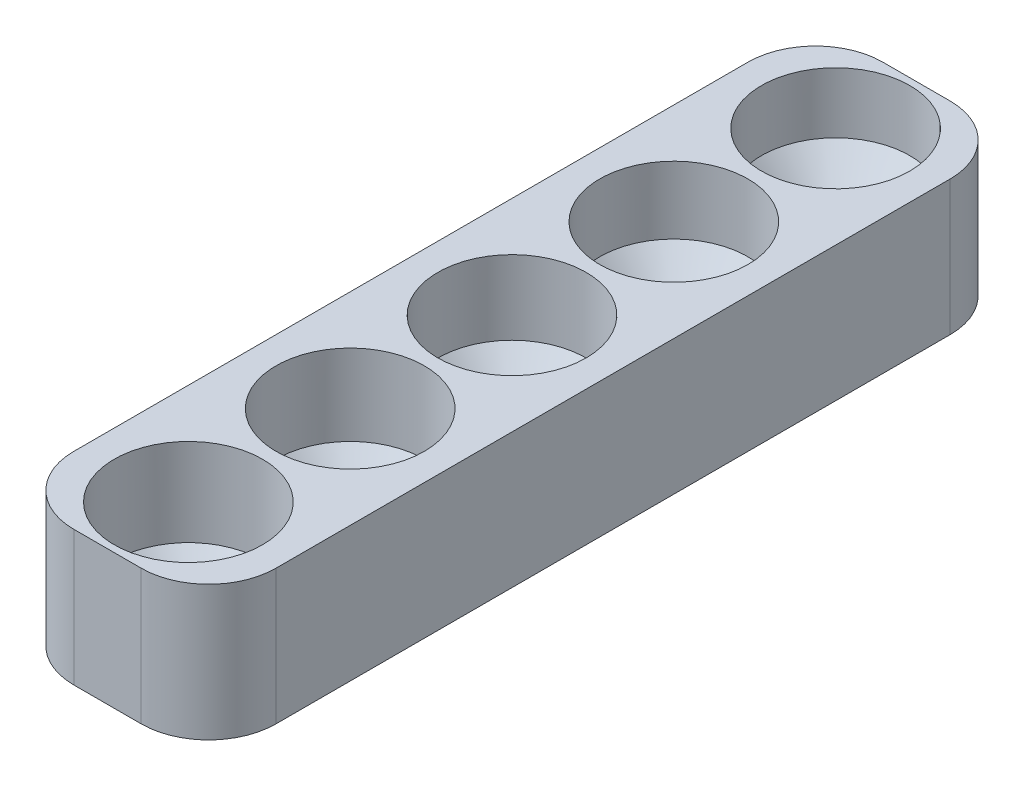
ISO-10303-21;
HEADER;
FILE_DESCRIPTION(('STEP AP214'),'2;1');
FILE_NAME('part.step','',(''),(''),'','','');
FILE_SCHEMA(('AUTOMOTIVE_DESIGN { 1 0 10303 214 1 1 1 1 }'));
ENDSEC;
DATA;
#1=APPLICATION_CONTEXT('core data for automotive mechanical design processes');
#2=APPLICATION_PROTOCOL_DEFINITION('international standard','automotive_design',2000,#1);
#3=PRODUCT_CONTEXT('',#1,'mechanical');
#4=PRODUCT('Part','Part','',(#3));
#5=PRODUCT_RELATED_PRODUCT_CATEGORY('part','',(#4));
#6=PRODUCT_DEFINITION_FORMATION('','',#4);
#7=PRODUCT_DEFINITION_CONTEXT('part definition',#1,'design');
#8=PRODUCT_DEFINITION('design','',#6,#7);
#9=PRODUCT_DEFINITION_SHAPE('','',#8);
#10=(LENGTH_UNIT() NAMED_UNIT(*) SI_UNIT(.MILLI.,.METRE.));
#11=(NAMED_UNIT(*) PLANE_ANGLE_UNIT() SI_UNIT($,.RADIAN.));
#12=(NAMED_UNIT(*) SI_UNIT($,.STERADIAN.) SOLID_ANGLE_UNIT());
#13=UNCERTAINTY_MEASURE_WITH_UNIT(LENGTH_MEASURE(1.E-05),#10,'distance_accuracy_value','');
#14=(GEOMETRIC_REPRESENTATION_CONTEXT(3) GLOBAL_UNCERTAINTY_ASSIGNED_CONTEXT((#13)) GLOBAL_UNIT_ASSIGNED_CONTEXT((#10,
#11,#12)) REPRESENTATION_CONTEXT('',''));
#15=CARTESIAN_POINT('',(0.,0.,0.));
#16=DIRECTION('',(0.,0.,1.));
#17=DIRECTION('',(1.,0.,0.));
#18=AXIS2_PLACEMENT_3D('',#15,#16,#17);
#19=CARTESIAN_POINT('',(-15.,3.,60.));
#20=DIRECTION('',(1.,0.,0.));
#21=DIRECTION('',(0.,1.,0.));
#22=AXIS2_PLACEMENT_3D('',#19,#20,#21);
#23=PLANE('',#22);
#24=DIRECTION('',(0.,0.,-1.));
#25=VECTOR('',#24,1.);
#26=CARTESIAN_POINT('',(-15.,3.,60.));
#27=LINE('',#26,#25);
#28=CARTESIAN_POINT('',(-15.,3.,50.));
#29=VERTEX_POINT('',#28);
#30=CARTESIAN_POINT('',(-15.,3.,-50.));
#31=VERTEX_POINT('',#30);
#32=EDGE_CURVE('E165',#29,#31,#27,.T.);
#33=ORIENTED_EDGE('',*,*,#32,.F.);
#34=DIRECTION('',(0.,-1.,0.));
#35=VECTOR('',#34,1.);
#36=CARTESIAN_POINT('',(-15.,3.,50.));
#37=LINE('',#36,#35);
#38=CARTESIAN_POINT('',(-15.,23.,50.));
#39=VERTEX_POINT('',#38);
#40=EDGE_CURVE('E119',#29,#39,#37,.F.);
#41=ORIENTED_EDGE('',*,*,#40,.T.);
#42=DIRECTION('',(0.,0.,-1.));
#43=VECTOR('',#42,1.);
#44=CARTESIAN_POINT('',(-15.,23.,60.));
#45=LINE('',#44,#43);
#46=CARTESIAN_POINT('',(-15.,23.,-50.));
#47=VERTEX_POINT('',#46);
#48=EDGE_CURVE('E149',#39,#47,#45,.T.);
#49=ORIENTED_EDGE('',*,*,#48,.T.);
#50=DIRECTION('',(0.,-1.,0.));
#51=VECTOR('',#50,1.);
#52=CARTESIAN_POINT('',(-15.,3.,-50.));
#53=LINE('',#52,#51);
#54=EDGE_CURVE('E125',#47,#31,#53,.T.);
#55=ORIENTED_EDGE('',*,*,#54,.T.);
#56=EDGE_LOOP('',(#33,#41,#49,#55));
#57=FACE_BOUND('',#56,.T.);
#58=ADVANCED_FACE('F47',(#57),#23,.F.);
#59=CARTESIAN_POINT('',(-15.,3.,60.));
#60=DIRECTION('',(0.,1.,0.));
#61=DIRECTION('',(-1.,0.,0.));
#62=AXIS2_PLACEMENT_3D('',#59,#60,#61);
#63=PLANE('',#62);
#64=CARTESIAN_POINT('',(0.,3.,48.));
#65=DIRECTION('',(0.,1.,0.));
#66=DIRECTION('',(-1.,0.,0.));
#67=AXIS2_PLACEMENT_3D('',#64,#65,#66);
#68=CIRCLE('',#67,4.5798188998388);
#69=CARTESIAN_POINT('',(-4.57981889983881,3.,48.));
#70=VERTEX_POINT('',#69);
#71=EDGE_CURVE('E205',#70,#70,#68,.T.);
#72=ORIENTED_EDGE('',*,*,#71,.T.);
#73=EDGE_LOOP('',(#72));
#74=FACE_BOUND('',#73,.T.);
#75=CARTESIAN_POINT('',(0.,3.,-24.));
#76=DIRECTION('',(0.,1.,0.));
#77=DIRECTION('',(-1.,0.,0.));
#78=AXIS2_PLACEMENT_3D('',#75,#76,#77);
#79=CIRCLE('',#78,1.83333333333334);
#80=CARTESIAN_POINT('',(0.,3.,-22.1666666666667));
#81=VERTEX_POINT('',#80);
#82=EDGE_CURVE('E201',#81,#81,#79,.T.);
#83=ORIENTED_EDGE('',*,*,#82,.T.);
#84=EDGE_LOOP('',(#83));
#85=FACE_BOUND('',#84,.T.);
#86=CARTESIAN_POINT('',(0.,3.,-48.));
#87=DIRECTION('',(0.,1.,0.));
#88=DIRECTION('',(-1.,0.,0.));
#89=AXIS2_PLACEMENT_3D('',#86,#87,#88);
#90=CIRCLE('',#89,0.91666666666667);
#91=CARTESIAN_POINT('',(0.,3.,-47.0833333333333));
#92=VERTEX_POINT('',#91);
#93=EDGE_CURVE('E197',#92,#92,#90,.T.);
#94=ORIENTED_EDGE('',*,*,#93,.T.);
#95=EDGE_LOOP('',(#94));
#96=FACE_BOUND('',#95,.T.);
#97=CARTESIAN_POINT('',(0.,3.,24.));
#98=DIRECTION('',(0.,1.,0.));
#99=DIRECTION('',(-1.,0.,0.));
#100=AXIS2_PLACEMENT_3D('',#97,#98,#99);
#101=CIRCLE('',#100,3.6649094499194);
#102=CARTESIAN_POINT('',(0.,3.,27.6649094499194));
#103=VERTEX_POINT('',#102);
#104=EDGE_CURVE('E193',#103,#103,#101,.T.);
#105=ORIENTED_EDGE('',*,*,#104,.T.);
#106=EDGE_LOOP('',(#105));
#107=FACE_BOUND('',#106,.T.);
#108=CARTESIAN_POINT('',(0.,3.,0.));
#109=DIRECTION('',(0.,1.,0.));
#110=DIRECTION('',(-1.,0.,0.));
#111=AXIS2_PLACEMENT_3D('',#108,#109,#110);
#112=CIRCLE('',#111,2.75);
#113=CARTESIAN_POINT('',(0.,3.,2.75));
#114=VERTEX_POINT('',#113);
#115=EDGE_CURVE('E189',#114,#114,#112,.T.);
#116=ORIENTED_EDGE('',*,*,#115,.T.);
#117=EDGE_LOOP('',(#116));
#118=FACE_BOUND('',#117,.T.);
#119=DIRECTION('',(1.,0.,0.));
#120=VECTOR('',#119,1.);
#121=CARTESIAN_POINT('',(-15.,3.,60.));
#122=LINE('',#121,#120);
#123=CARTESIAN_POINT('',(-4.99999999999999,3.,60.));
#124=VERTEX_POINT('',#123);
#125=CARTESIAN_POINT('',(5.,3.,60.));
#126=VERTEX_POINT('',#125);
#127=EDGE_CURVE('E133',#124,#126,#122,.T.);
#128=ORIENTED_EDGE('',*,*,#127,.F.);
#129=CARTESIAN_POINT('',(-4.99999999999999,3.,50.));
#130=DIRECTION('',(0.,1.,0.));
#131=DIRECTION('',(-1.,0.,0.));
#132=AXIS2_PLACEMENT_3D('',#129,#130,#131);
#133=CIRCLE('',#132,10.);
#134=EDGE_CURVE('E114',#124,#29,#133,.F.);
#135=ORIENTED_EDGE('',*,*,#134,.T.);
#136=ORIENTED_EDGE('',*,*,#32,.T.);
#137=CARTESIAN_POINT('',(-4.99999999999999,3.,-50.));
#138=DIRECTION('',(0.,1.,0.));
#139=DIRECTION('',(-1.,0.,0.));
#140=AXIS2_PLACEMENT_3D('',#137,#138,#139);
#141=CIRCLE('',#140,10.);
#142=CARTESIAN_POINT('',(-4.99999999999999,3.,-60.));
#143=VERTEX_POINT('',#142);
#144=EDGE_CURVE('E126',#31,#143,#141,.F.);
#145=ORIENTED_EDGE('',*,*,#144,.T.);
#146=DIRECTION('',(1.,0.,0.));
#147=VECTOR('',#146,1.);
#148=CARTESIAN_POINT('',(-15.,3.,-60.));
#149=LINE('',#148,#147);
#150=CARTESIAN_POINT('',(5.,3.,-60.));
#151=VERTEX_POINT('',#150);
#152=EDGE_CURVE('E151',#143,#151,#149,.T.);
#153=ORIENTED_EDGE('',*,*,#152,.T.);
#154=CARTESIAN_POINT('',(5.,3.,-50.));
#155=DIRECTION('',(0.,1.,0.));
#156=DIRECTION('',(-1.,0.,0.));
#157=AXIS2_PLACEMENT_3D('',#154,#155,#156);
#158=CIRCLE('',#157,10.);
#159=CARTESIAN_POINT('',(15.,3.,-50.));
#160=VERTEX_POINT('',#159);
#161=EDGE_CURVE('E213',#151,#160,#158,.F.);
#162=ORIENTED_EDGE('',*,*,#161,.T.);
#163=DIRECTION('',(0.,0.,-1.));
#164=VECTOR('',#163,1.);
#165=CARTESIAN_POINT('',(15.,3.,60.));
#166=LINE('',#165,#164);
#167=CARTESIAN_POINT('',(15.,3.,50.));
#168=VERTEX_POINT('',#167);
#169=EDGE_CURVE('E161',#168,#160,#166,.T.);
#170=ORIENTED_EDGE('',*,*,#169,.F.);
#171=CARTESIAN_POINT('',(5.,3.,50.));
#172=DIRECTION('',(0.,1.,0.));
#173=DIRECTION('',(-1.,0.,0.));
#174=AXIS2_PLACEMENT_3D('',#171,#172,#173);
#175=CIRCLE('',#174,10.);
#176=EDGE_CURVE('E138',#168,#126,#175,.F.);
#177=ORIENTED_EDGE('',*,*,#176,.T.);
#178=EDGE_LOOP('',(#128,#135,#136,#145,#153,#162,#170,#177));
#179=FACE_BOUND('',#178,.T.);
#180=ADVANCED_FACE('F141',(#74,#85,#96,#107,#118,#179),#63,.F.);
#181=CARTESIAN_POINT('',(15.,3.,60.));
#182=DIRECTION('',(-1.,0.,0.));
#183=DIRECTION('',(0.,0.,1.));
#184=AXIS2_PLACEMENT_3D('',#181,#182,#183);
#185=PLANE('',#184);
#186=ORIENTED_EDGE('',*,*,#169,.T.);
#187=DIRECTION('',(0.,1.,0.));
#188=VECTOR('',#187,1.);
#189=CARTESIAN_POINT('',(15.,23.,-50.));
#190=LINE('',#189,#188);
#191=CARTESIAN_POINT('',(15.,23.,-50.));
#192=VERTEX_POINT('',#191);
#193=EDGE_CURVE('E11',#160,#192,#190,.T.);
#194=ORIENTED_EDGE('',*,*,#193,.T.);
#195=DIRECTION('',(0.,0.,-1.));
#196=VECTOR('',#195,1.);
#197=CARTESIAN_POINT('',(15.,23.,60.));
#198=LINE('',#197,#196);
#199=CARTESIAN_POINT('',(15.,23.,50.));
#200=VERTEX_POINT('',#199);
#201=EDGE_CURVE('E158',#200,#192,#198,.T.);
#202=ORIENTED_EDGE('',*,*,#201,.F.);
#203=DIRECTION('',(0.,1.,0.));
#204=VECTOR('',#203,1.);
#205=CARTESIAN_POINT('',(15.,3.,50.));
#206=LINE('',#205,#204);
#207=EDGE_CURVE('E56',#200,#168,#206,.F.);
#208=ORIENTED_EDGE('',*,*,#207,.T.);
#209=EDGE_LOOP('',(#186,#194,#202,#208));
#210=FACE_BOUND('',#209,.T.);
#211=ADVANCED_FACE('F242',(#210),#185,.F.);
#212=CARTESIAN_POINT('',(-15.,23.,60.));
#213=DIRECTION('',(0.,-1.,0.));
#214=DIRECTION('',(1.,0.,0.));
#215=AXIS2_PLACEMENT_3D('',#212,#213,#214);
#216=PLANE('',#215);
#217=CARTESIAN_POINT('',(0.,23.,48.));
#218=DIRECTION('',(0.,-1.,0.));
#219=DIRECTION('',(1.,0.,0.));
#220=AXIS2_PLACEMENT_3D('',#217,#218,#219);
#221=CIRCLE('',#220,11.);
#222=CARTESIAN_POINT('',(11.,23.,48.));
#223=VERTEX_POINT('',#222);
#224=EDGE_CURVE('E185',#223,#223,#221,.T.);
#225=ORIENTED_EDGE('',*,*,#224,.T.);
#226=EDGE_LOOP('',(#225));
#227=FACE_BOUND('',#226,.T.);
#228=CARTESIAN_POINT('',(0.,23.,-24.));
#229=DIRECTION('',(0.,-1.,0.));
#230=DIRECTION('',(1.,0.,0.));
#231=AXIS2_PLACEMENT_3D('',#228,#229,#230);
#232=CIRCLE('',#231,11.);
#233=CARTESIAN_POINT('',(11.,23.,-24.));
#234=VERTEX_POINT('',#233);
#235=EDGE_CURVE('E181',#234,#234,#232,.T.);
#236=ORIENTED_EDGE('',*,*,#235,.T.);
#237=EDGE_LOOP('',(#236));
#238=FACE_BOUND('',#237,.T.);
#239=CARTESIAN_POINT('',(0.,23.,-48.));
#240=DIRECTION('',(0.,-1.,0.));
#241=DIRECTION('',(1.,0.,0.));
#242=AXIS2_PLACEMENT_3D('',#239,#240,#241);
#243=CIRCLE('',#242,11.);
#244=CARTESIAN_POINT('',(11.,23.,-48.));
#245=VERTEX_POINT('',#244);
#246=EDGE_CURVE('E177',#245,#245,#243,.T.);
#247=ORIENTED_EDGE('',*,*,#246,.T.);
#248=EDGE_LOOP('',(#247));
#249=FACE_BOUND('',#248,.T.);
#250=CARTESIAN_POINT('',(0.,23.,24.));
#251=DIRECTION('',(0.,-1.,0.));
#252=DIRECTION('',(1.,0.,0.));
#253=AXIS2_PLACEMENT_3D('',#250,#251,#252);
#254=CIRCLE('',#253,11.);
#255=CARTESIAN_POINT('',(11.,23.,24.));
#256=VERTEX_POINT('',#255);
#257=EDGE_CURVE('E172',#256,#256,#254,.T.);
#258=ORIENTED_EDGE('',*,*,#257,.T.);
#259=EDGE_LOOP('',(#258));
#260=FACE_BOUND('',#259,.T.);
#261=CARTESIAN_POINT('',(0.,23.,0.));
#262=DIRECTION('',(0.,-1.,0.));
#263=DIRECTION('',(1.,0.,0.));
#264=AXIS2_PLACEMENT_3D('',#261,#262,#263);
#265=CIRCLE('',#264,11.);
#266=CARTESIAN_POINT('',(11.,23.,0.));
#267=VERTEX_POINT('',#266);
#268=EDGE_CURVE('E168',#267,#267,#265,.T.);
#269=ORIENTED_EDGE('',*,*,#268,.T.);
#270=EDGE_LOOP('',(#269));
#271=FACE_BOUND('',#270,.T.);
#272=ORIENTED_EDGE('',*,*,#48,.F.);
#273=CARTESIAN_POINT('',(-5.,23.,50.));
#274=DIRECTION('',(0.,-1.,0.));
#275=DIRECTION('',(1.,0.,0.));
#276=AXIS2_PLACEMENT_3D('',#273,#274,#275);
#277=CIRCLE('',#276,10.);
#278=CARTESIAN_POINT('',(-5.,23.,60.));
#279=VERTEX_POINT('',#278);
#280=EDGE_CURVE('E231',#39,#279,#277,.F.);
#281=ORIENTED_EDGE('',*,*,#280,.T.);
#282=DIRECTION('',(-1.,0.,0.));
#283=VECTOR('',#282,1.);
#284=CARTESIAN_POINT('',(-15.,23.,60.));
#285=LINE('',#284,#283);
#286=CARTESIAN_POINT('',(5.,23.,60.));
#287=VERTEX_POINT('',#286);
#288=EDGE_CURVE('E136',#287,#279,#285,.T.);
#289=ORIENTED_EDGE('',*,*,#288,.F.);
#290=CARTESIAN_POINT('',(5.,23.,50.));
#291=DIRECTION('',(0.,-1.,0.));
#292=DIRECTION('',(1.,0.,0.));
#293=AXIS2_PLACEMENT_3D('',#290,#291,#292);
#294=CIRCLE('',#293,10.);
#295=EDGE_CURVE('E223',#287,#200,#294,.F.);
#296=ORIENTED_EDGE('',*,*,#295,.T.);
#297=ORIENTED_EDGE('',*,*,#201,.T.);
#298=CARTESIAN_POINT('',(5.,23.,-50.));
#299=DIRECTION('',(0.,-1.,0.));
#300=DIRECTION('',(1.,0.,0.));
#301=AXIS2_PLACEMENT_3D('',#298,#299,#300);
#302=CIRCLE('',#301,10.);
#303=CARTESIAN_POINT('',(5.,23.,-60.));
#304=VERTEX_POINT('',#303);
#305=EDGE_CURVE('E70',#192,#304,#302,.F.);
#306=ORIENTED_EDGE('',*,*,#305,.T.);
#307=DIRECTION('',(-1.,0.,0.));
#308=VECTOR('',#307,1.);
#309=CARTESIAN_POINT('',(-15.,23.,-60.));
#310=LINE('',#309,#308);
#311=CARTESIAN_POINT('',(-5.,23.,-60.));
#312=VERTEX_POINT('',#311);
#313=EDGE_CURVE('E145',#304,#312,#310,.T.);
#314=ORIENTED_EDGE('',*,*,#313,.T.);
#315=CARTESIAN_POINT('',(-5.,23.,-50.));
#316=DIRECTION('',(0.,-1.,0.));
#317=DIRECTION('',(1.,0.,0.));
#318=AXIS2_PLACEMENT_3D('',#315,#316,#317);
#319=CIRCLE('',#318,10.);
#320=EDGE_CURVE('E228',#312,#47,#319,.F.);
#321=ORIENTED_EDGE('',*,*,#320,.T.);
#322=EDGE_LOOP('',(#272,#281,#289,#296,#297,#306,#314,#321));
#323=FACE_BOUND('',#322,.T.);
#324=ADVANCED_FACE('F248',(#227,#238,#249,#260,#271,#323),#216,.F.);
#325=CARTESIAN_POINT('',(0.,0.,60.));
#326=DIRECTION('',(0.,0.,-1.));
#327=DIRECTION('',(-1.,0.,0.));
#328=AXIS2_PLACEMENT_3D('',#325,#326,#327);
#329=PLANE('',#328);
#330=ORIENTED_EDGE('',*,*,#288,.T.);
#331=DIRECTION('',(0.,-1.,0.));
#332=VECTOR('',#331,1.);
#333=CARTESIAN_POINT('',(-4.99999999999999,0.,60.));
#334=LINE('',#333,#332);
#335=EDGE_CURVE('E118',#279,#124,#334,.T.);
#336=ORIENTED_EDGE('',*,*,#335,.T.);
#337=ORIENTED_EDGE('',*,*,#127,.T.);
#338=DIRECTION('',(0.,1.,0.));
#339=VECTOR('',#338,1.);
#340=CARTESIAN_POINT('',(5.,0.,60.));
#341=LINE('',#340,#339);
#342=EDGE_CURVE('E139',#126,#287,#341,.T.);
#343=ORIENTED_EDGE('',*,*,#342,.T.);
#344=EDGE_LOOP('',(#330,#336,#337,#343));
#345=FACE_BOUND('',#344,.T.);
#346=ADVANCED_FACE('F131',(#345),#329,.F.);
#347=CARTESIAN_POINT('',(0.,0.,-60.));
#348=DIRECTION('',(0.,0.,-1.));
#349=DIRECTION('',(-1.,0.,0.));
#350=AXIS2_PLACEMENT_3D('',#347,#348,#349);
#351=PLANE('',#350);
#352=ORIENTED_EDGE('',*,*,#152,.F.);
#353=DIRECTION('',(0.,-1.,0.));
#354=VECTOR('',#353,1.);
#355=CARTESIAN_POINT('',(-5.,23.,-60.));
#356=LINE('',#355,#354);
#357=EDGE_CURVE('E63',#143,#312,#356,.F.);
#358=ORIENTED_EDGE('',*,*,#357,.T.);
#359=ORIENTED_EDGE('',*,*,#313,.F.);
#360=DIRECTION('',(0.,1.,0.));
#361=VECTOR('',#360,1.);
#362=CARTESIAN_POINT('',(5.,3.,-60.));
#363=LINE('',#362,#361);
#364=EDGE_CURVE('E234',#304,#151,#363,.F.);
#365=ORIENTED_EDGE('',*,*,#364,.T.);
#366=EDGE_LOOP('',(#352,#358,#359,#365));
#367=FACE_BOUND('',#366,.T.);
#368=ADVANCED_FACE('F254',(#367),#351,.T.);
#369=CARTESIAN_POINT('',(0.,0.,0.));
#370=DIRECTION('',(0.,1.,0.));
#371=DIRECTION('',(0.,0.,1.));
#372=AXIS2_PLACEMENT_3D('',#369,#370,#371);
#373=CONICAL_SURFACE('',#372,0.,0.741947268005917);
#374=CARTESIAN_POINT('',(0.,12.,0.));
#375=DIRECTION('',(0.,-1.,0.));
#376=DIRECTION('',(0.,0.,-1.));
#377=AXIS2_PLACEMENT_3D('',#374,#375,#376);
#378=CIRCLE('',#377,11.);
#379=CARTESIAN_POINT('',(0.,12.,11.));
#380=VERTEX_POINT('',#379);
#381=EDGE_CURVE('E173',#380,#380,#378,.T.);
#382=CARTESIAN_POINT('',(0.,12.,11.));
#383=CARTESIAN_POINT('',(0.,11.90625,10.9140625));
#384=CARTESIAN_POINT('',(0.,11.8125,10.828125));
#385=CARTESIAN_POINT('',(0.,11.625,10.65625));
#386=CARTESIAN_POINT('',(0.,11.53125,10.5703125));
#387=CARTESIAN_POINT('',(0.,11.34375,10.3984375));
#388=CARTESIAN_POINT('',(0.,11.25,10.3125));
#389=CARTESIAN_POINT('',(0.,11.0625,10.140625));
#390=CARTESIAN_POINT('',(0.,10.96875,10.0546875));
#391=CARTESIAN_POINT('',(0.,10.78125,9.8828125));
#392=CARTESIAN_POINT('',(0.,10.6875,9.796875));
#393=CARTESIAN_POINT('',(0.,10.5,9.625));
#394=CARTESIAN_POINT('',(0.,10.40625,9.5390625));
#395=CARTESIAN_POINT('',(0.,10.21875,9.3671875));
#396=CARTESIAN_POINT('',(0.,10.125,9.28125));
#397=CARTESIAN_POINT('',(0.,9.9375,9.109375));
#398=CARTESIAN_POINT('',(0.,9.84375,9.0234375));
#399=CARTESIAN_POINT('',(0.,9.65625,8.8515625));
#400=CARTESIAN_POINT('',(0.,9.5625,8.765625));
#401=CARTESIAN_POINT('',(0.,9.375,8.59375));
#402=CARTESIAN_POINT('',(0.,9.28125,8.5078125));
#403=CARTESIAN_POINT('',(0.,9.09375,8.3359375));
#404=CARTESIAN_POINT('',(0.,9.,8.25));
#405=CARTESIAN_POINT('',(0.,8.8125,8.078125));
#406=CARTESIAN_POINT('',(0.,8.71875,7.9921875));
#407=CARTESIAN_POINT('',(0.,8.53125,7.8203125));
#408=CARTESIAN_POINT('',(0.,8.4375,7.734375));
#409=CARTESIAN_POINT('',(0.,8.25,7.5625));
#410=CARTESIAN_POINT('',(0.,8.15625,7.4765625));
#411=CARTESIAN_POINT('',(0.,7.96875,7.3046875));
#412=CARTESIAN_POINT('',(0.,7.875,7.21875));
#413=CARTESIAN_POINT('',(0.,7.6875,7.046875));
#414=CARTESIAN_POINT('',(0.,7.59375,6.9609375));
#415=CARTESIAN_POINT('',(0.,7.40625,6.7890625));
#416=CARTESIAN_POINT('',(0.,7.3125,6.703125));
#417=CARTESIAN_POINT('',(0.,7.125,6.53125));
#418=CARTESIAN_POINT('',(0.,7.03125,6.4453125));
#419=CARTESIAN_POINT('',(0.,6.84375,6.2734375));
#420=CARTESIAN_POINT('',(0.,6.75,6.1875));
#421=CARTESIAN_POINT('',(0.,6.5625,6.015625));
#422=CARTESIAN_POINT('',(0.,6.46875,5.9296875));
#423=CARTESIAN_POINT('',(0.,6.28125,5.7578125));
#424=CARTESIAN_POINT('',(0.,6.1875,5.671875));
#425=CARTESIAN_POINT('',(0.,6.,5.5));
#426=CARTESIAN_POINT('',(0.,5.90625,5.4140625));
#427=CARTESIAN_POINT('',(0.,5.71875,5.2421875));
#428=CARTESIAN_POINT('',(0.,5.625,5.15625));
#429=CARTESIAN_POINT('',(0.,5.4375,4.984375));
#430=CARTESIAN_POINT('',(0.,5.34375,4.8984375));
#431=CARTESIAN_POINT('',(0.,5.15625,4.7265625));
#432=CARTESIAN_POINT('',(0.,5.0625,4.640625));
#433=CARTESIAN_POINT('',(0.,4.875,4.46875));
#434=CARTESIAN_POINT('',(0.,4.78125,4.3828125));
#435=CARTESIAN_POINT('',(0.,4.59375,4.2109375));
#436=CARTESIAN_POINT('',(0.,4.5,4.125));
#437=CARTESIAN_POINT('',(0.,4.3125,3.953125));
#438=CARTESIAN_POINT('',(0.,4.21875,3.8671875));
#439=CARTESIAN_POINT('',(0.,4.03125,3.6953125));
#440=CARTESIAN_POINT('',(0.,3.9375,3.609375));
#441=CARTESIAN_POINT('',(0.,3.75,3.4375));
#442=CARTESIAN_POINT('',(0.,3.65625,3.3515625));
#443=CARTESIAN_POINT('',(0.,3.46875,3.1796875));
#444=CARTESIAN_POINT('',(0.,3.375,3.09375));
#445=CARTESIAN_POINT('',(0.,3.1875,2.921875));
#446=CARTESIAN_POINT('',(0.,3.09375,2.8359375));
#447=CARTESIAN_POINT('',(0.,3.,2.75));
#448=B_SPLINE_CURVE_WITH_KNOTS('',3,(#382,#383,#384,#385,#386,#387,#388,#389,#390,#391,#392,
#393,#394,#395,#396,#397,#398,#399,#400,#401,#402,#403,#404,#405,#406,#407,#408,#409,#410,#411,
#412,#413,#414,#415,#416,#417,#418,#419,#420,#421,#422,#423,#424,#425,#426,#427,#428,#429,#430,
#431,#432,#433,#434,#435,#436,#437,#438,#439,#440,#441,#442,#443,#444,#445,#446,#447),
.UNSPECIFIED.,.F.,.F.,(4,2,2,2,2,2,2,2,2,2,2,2,2,2,2,2,2,2,2,2,2,2,2,2,2,2,2,2,2,2,2,2,4),(0.,
0.381534857721088,0.763069715442174,1.14460457316326,1.52613943088435,1.90767428860543,
2.28920914632652,2.67074400404761,3.05227886176869,3.43381371948978,3.81534857721087,
4.19688343493195,4.57841829265304,4.95995315037413,5.34148800809522,5.7230228658163,
6.10455772353739,6.48609258125847,6.86762743897956,7.24916229670065,7.63069715442173,
8.01223201214282,8.39376686986391,8.775301727585,9.15683658530608,9.53837144302717,
9.91990630074826,10.3014411584693,10.6829760161904,11.0645108739115,11.4460457316326,
11.8275805893537,12.2091154470748),.UNSPECIFIED.);
#449=EDGE_CURVE('BSEAM296',#380,#114,#448,.T.);
#450=ORIENTED_EDGE('',*,*,#381,.F.);
#451=ORIENTED_EDGE('',*,*,#115,.F.);
#452=ORIENTED_EDGE('',*,*,#449,.T.);
#453=ORIENTED_EDGE('',*,*,#449,.F.);
#454=EDGE_LOOP('',(#450,#452,#451,#453));
#455=FACE_BOUND('',#454,.T.);
#456=ADVANCED_FACE('F296',(#455),#373,.F.);
#457=CARTESIAN_POINT('',(0.,0.,0.));
#458=DIRECTION('',(0.,-1.,0.));
#459=DIRECTION('',(0.,0.,-1.));
#460=AXIS2_PLACEMENT_3D('',#457,#458,#459);
#461=CYLINDRICAL_SURFACE('',#460,11.);
#462=ORIENTED_EDGE('',*,*,#381,.T.);
#463=EDGE_LOOP('',(#462));
#464=FACE_BOUND('',#463,.T.);
#465=ORIENTED_EDGE('',*,*,#268,.F.);
#466=EDGE_LOOP('',(#465));
#467=FACE_BOUND('',#466,.T.);
#468=ADVANCED_FACE('F298',(#464,#467),#461,.F.);
#469=CARTESIAN_POINT('',(0.,-0.998083036275707,24.));
#470=DIRECTION('',(0.,1.,0.));
#471=DIRECTION('',(0.,0.,1.));
#472=AXIS2_PLACEMENT_3D('',#469,#470,#471);
#473=CONICAL_SURFACE('',#472,0.,0.741947268005917);
#474=CARTESIAN_POINT('',(0.,11.0019169637243,24.));
#475=DIRECTION('',(0.,-1.,0.));
#476=DIRECTION('',(0.,0.,-1.));
#477=AXIS2_PLACEMENT_3D('',#474,#475,#476);
#478=CIRCLE('',#477,11.);
#479=CARTESIAN_POINT('',(0.,11.0019169637243,35.));
#480=VERTEX_POINT('',#479);
#481=EDGE_CURVE('E270',#480,#480,#478,.T.);
#482=CARTESIAN_POINT('',(0.,11.0019169637243,35.));
#483=CARTESIAN_POINT('',(0.,10.9185636620188,34.92359280677));
#484=CARTESIAN_POINT('',(0.,10.8352103603134,34.84718561354));
#485=CARTESIAN_POINT('',(0.,10.6685037569024,34.69437122708));
#486=CARTESIAN_POINT('',(0.,10.585150455197,34.61796403385));
#487=CARTESIAN_POINT('',(0.,10.4184438517861,34.46514964739));
#488=CARTESIAN_POINT('',(0.,10.3350905500806,34.38874245416));
#489=CARTESIAN_POINT('',(0.,10.1683839466697,34.2359280676999));
#490=CARTESIAN_POINT('',(0.,10.0850306449642,34.1595208744699));
#491=CARTESIAN_POINT('',(0.,9.9183240415533,34.0067064880099));
#492=CARTESIAN_POINT('',(0.,9.83497073984783,33.9302992947799));
#493=CARTESIAN_POINT('',(0.,9.66826413643691,33.7774849083199));
#494=CARTESIAN_POINT('',(0.,9.58491083473145,33.7010777150899));
#495=CARTESIAN_POINT('',(0.,9.41820423132053,33.5482633286299));
#496=CARTESIAN_POINT('',(0.,9.33485092961507,33.4718561353999));
#497=CARTESIAN_POINT('',(0.,9.16814432620414,33.3190417489399));
#498=CARTESIAN_POINT('',(0.,9.08479102449868,33.2426345557099));
#499=CARTESIAN_POINT('',(0.,8.91808442108776,33.0898201692498));
#500=CARTESIAN_POINT('',(0.,8.8347311193823,33.0134129760198));
#501=CARTESIAN_POINT('',(0.,8.66802451597137,32.8605985895598));
#502=CARTESIAN_POINT('',(0.,8.58467121426591,32.7841913963298));
#503=CARTESIAN_POINT('',(0.,8.41796461085499,32.6313770098698));
#504=CARTESIAN_POINT('',(0.,8.33461130914953,32.5549698166398));
#505=CARTESIAN_POINT('',(0.,8.16790470573861,32.4021554301798));
#506=CARTESIAN_POINT('',(0.,8.08455140403315,32.3257482369498));
#507=CARTESIAN_POINT('',(0.,7.91784480062222,32.1729338504898));
#508=CARTESIAN_POINT('',(0.,7.83449149891676,32.0965266572598));
#509=CARTESIAN_POINT('',(0.,7.66778489550584,31.9437122707998));
#510=CARTESIAN_POINT('',(0.,7.58443159380038,31.8673050775697));
#511=CARTESIAN_POINT('',(0.,7.41772499038946,31.7144906911097));
#512=CARTESIAN_POINT('',(0.,7.33437168868399,31.6380834978797));
#513=CARTESIAN_POINT('',(0.,7.16766508527307,31.4852691114197));
#514=CARTESIAN_POINT('',(0.,7.08431178356761,31.4088619181897));
#515=CARTESIAN_POINT('',(0.,6.91760518015669,31.2560475317297));
#516=CARTESIAN_POINT('',(0.,6.83425187845123,31.1796403384997));
#517=CARTESIAN_POINT('',(0.,6.6675452750403,31.0268259520397));
#518=CARTESIAN_POINT('',(0.,6.58419197333484,30.9504187588097));
#519=CARTESIAN_POINT('',(0.,6.41748536992392,30.7976043723497));
#520=CARTESIAN_POINT('',(0.,6.33413206821846,30.7211971791196));
#521=CARTESIAN_POINT('',(0.,6.16742546480753,30.5683827926596));
#522=CARTESIAN_POINT('',(0.,6.08407216310207,30.4919755994296));
#523=CARTESIAN_POINT('',(0.,5.91736555969115,30.3391612129696));
#524=CARTESIAN_POINT('',(0.,5.83401225798569,30.2627540197396));
#525=CARTESIAN_POINT('',(0.,5.66730565457477,30.1099396332796));
#526=CARTESIAN_POINT('',(0.,5.5839523528693,30.0335324400496));
#527=CARTESIAN_POINT('',(0.,5.41724574945838,29.8807180535896));
#528=CARTESIAN_POINT('',(0.,5.33389244775292,29.8043108603596));
#529=CARTESIAN_POINT('',(0.,5.167185844342,29.6514964738996));
#530=CARTESIAN_POINT('',(0.,5.08383254263654,29.5750892806696));
#531=CARTESIAN_POINT('',(0.,4.91712593922561,29.4222748942095));
#532=CARTESIAN_POINT('',(0.,4.83377263752015,29.3458677009795));
#533=CARTESIAN_POINT('',(0.,4.66706603410923,29.1930533145195));
#534=CARTESIAN_POINT('',(0.,4.58371273240377,29.1166461212895));
#535=CARTESIAN_POINT('',(0.,4.41700612899285,28.9638317348295));
#536=CARTESIAN_POINT('',(0.,4.33365282728739,28.8874245415995));
#537=CARTESIAN_POINT('',(0.,4.16694622387646,28.7346101551395));
#538=CARTESIAN_POINT('',(0.,4.083592922171,28.6582029619095));
#539=CARTESIAN_POINT('',(0.,3.91688631876008,28.5053885754495));
#540=CARTESIAN_POINT('',(0.,3.83353301705462,28.4289813822195));
#541=CARTESIAN_POINT('',(0.,3.66682641364369,28.2761669957594));
#542=CARTESIAN_POINT('',(0.,3.58347311193823,28.1997598025294));
#543=CARTESIAN_POINT('',(0.,3.41676650852731,28.0469454160694));
#544=CARTESIAN_POINT('',(0.,3.33341320682185,27.9705382228394));
#545=CARTESIAN_POINT('',(0.,3.16670660341093,27.8177238363794));
#546=CARTESIAN_POINT('',(0.,3.08335330170546,27.7413166431494));
#547=CARTESIAN_POINT('',(0.,3.,27.6649094499194));
#548=B_SPLINE_CURVE_WITH_KNOTS('',3,(#482,#483,#484,#485,#486,#487,#488,#489,#490,#491,#492,
#493,#494,#495,#496,#497,#498,#499,#500,#501,#502,#503,#504,#505,#506,#507,#508,#509,#510,#511,
#512,#513,#514,#515,#516,#517,#518,#519,#520,#521,#522,#523,#524,#525,#526,#527,#528,#529,#530,
#531,#532,#533,#534,#535,#536,#537,#538,#539,#540,#541,#542,#543,#544,#545,#546,#547),
.UNSPECIFIED.,.F.,.F.,(4,2,2,2,2,2,2,2,2,2,2,2,2,2,2,2,2,2,2,2,2,2,2,2,2,2,2,2,2,2,2,2,4),(0.,
0.33922336113894,0.678446722277886,1.01767008341683,1.35689344455578,1.69611680569472,
2.03534016683367,2.37456352797261,2.71378688911156,3.0530102502505,3.39223361138944,
3.73145697252839,4.07068033366733,4.40990369480627,4.74912705594522,5.08835041708416,
5.42757377822311,5.76679713936205,6.106020500501,6.44524386163994,6.78446722277888,
7.12369058391783,7.46291394505677,7.80213730619572,8.14136066733466,8.4805840284736,
8.81980738961255,9.15903075075149,9.49825411189044,9.83747747302938,10.1767008341683,
10.5159241953073,10.8551475564462),.UNSPECIFIED.);
#549=EDGE_CURVE('BSEAM305',#480,#103,#548,.T.);
#550=ORIENTED_EDGE('',*,*,#481,.F.);
#551=ORIENTED_EDGE('',*,*,#104,.F.);
#552=ORIENTED_EDGE('',*,*,#549,.T.);
#553=ORIENTED_EDGE('',*,*,#549,.F.);
#554=EDGE_LOOP('',(#550,#552,#551,#553));
#555=FACE_BOUND('',#554,.T.);
#556=ADVANCED_FACE('F305',(#555),#473,.F.);
#557=CARTESIAN_POINT('',(0.,-0.998083036275707,24.));
#558=DIRECTION('',(0.,-1.,0.));
#559=DIRECTION('',(0.,0.,-1.));
#560=AXIS2_PLACEMENT_3D('',#557,#558,#559);
#561=CYLINDRICAL_SURFACE('',#560,11.);
#562=ORIENTED_EDGE('',*,*,#481,.T.);
#563=EDGE_LOOP('',(#562));
#564=FACE_BOUND('',#563,.T.);
#565=ORIENTED_EDGE('',*,*,#257,.F.);
#566=EDGE_LOOP('',(#565));
#567=FACE_BOUND('',#566,.T.);
#568=ADVANCED_FACE('F284',(#564,#567),#561,.F.);
#569=CARTESIAN_POINT('',(0.,2.,-48.));
#570=DIRECTION('',(0.,1.,0.));
#571=DIRECTION('',(0.,0.,1.));
#572=AXIS2_PLACEMENT_3D('',#569,#570,#571);
#573=CONICAL_SURFACE('',#572,0.,0.741947268005918);
#574=CARTESIAN_POINT('',(0.,14.,-48.));
#575=DIRECTION('',(0.,-1.,0.));
#576=DIRECTION('',(0.,0.,-1.));
#577=AXIS2_PLACEMENT_3D('',#574,#575,#576);
#578=CIRCLE('',#577,11.);
#579=CARTESIAN_POINT('',(0.,14.,-37.));
#580=VERTEX_POINT('',#579);
#581=EDGE_CURVE('E266',#580,#580,#578,.T.);
#582=CARTESIAN_POINT('',(0.,14.,-37.));
#583=CARTESIAN_POINT('',(0.,13.8854166666667,-37.1050347222222));
#584=CARTESIAN_POINT('',(0.,13.7708333333333,-37.2100694444444));
#585=CARTESIAN_POINT('',(0.,13.5416666666667,-37.4201388888889));
#586=CARTESIAN_POINT('',(0.,13.4270833333333,-37.5251736111111));
#587=CARTESIAN_POINT('',(0.,13.1979166666667,-37.7352430555556));
#588=CARTESIAN_POINT('',(0.,13.0833333333333,-37.8402777777778));
#589=CARTESIAN_POINT('',(0.,12.8541666666667,-38.0503472222222));
#590=CARTESIAN_POINT('',(0.,12.7395833333333,-38.1553819444444));
#591=CARTESIAN_POINT('',(0.,12.5104166666667,-38.3654513888889));
#592=CARTESIAN_POINT('',(0.,12.3958333333333,-38.4704861111111));
#593=CARTESIAN_POINT('',(0.,12.1666666666667,-38.6805555555555));
#594=CARTESIAN_POINT('',(0.,12.0520833333333,-38.7855902777778));
#595=CARTESIAN_POINT('',(0.,11.8229166666667,-38.9956597222222));
#596=CARTESIAN_POINT('',(0.,11.7083333333333,-39.1006944444444));
#597=CARTESIAN_POINT('',(0.,11.4791666666667,-39.3107638888889));
#598=CARTESIAN_POINT('',(0.,11.3645833333333,-39.4157986111111));
#599=CARTESIAN_POINT('',(0.,11.1354166666667,-39.6258680555556));
#600=CARTESIAN_POINT('',(0.,11.0208333333333,-39.7309027777778));
#601=CARTESIAN_POINT('',(0.,10.7916666666667,-39.9409722222222));
#602=CARTESIAN_POINT('',(0.,10.6770833333333,-40.0460069444444));
#603=CARTESIAN_POINT('',(0.,10.4479166666667,-40.2560763888889));
#604=CARTESIAN_POINT('',(0.,10.3333333333333,-40.3611111111111));
#605=CARTESIAN_POINT('',(0.,10.1041666666667,-40.5711805555556));
#606=CARTESIAN_POINT('',(0.,9.98958333333334,-40.6762152777778));
#607=CARTESIAN_POINT('',(0.,9.76041666666667,-40.8862847222222));
#608=CARTESIAN_POINT('',(0.,9.64583333333334,-40.9913194444444));
#609=CARTESIAN_POINT('',(0.,9.41666666666667,-41.2013888888889));
#610=CARTESIAN_POINT('',(0.,9.30208333333334,-41.3064236111111));
#611=CARTESIAN_POINT('',(0.,9.07291666666667,-41.5164930555556));
#612=CARTESIAN_POINT('',(0.,8.95833333333334,-41.6215277777778));
#613=CARTESIAN_POINT('',(0.,8.72916666666667,-41.8315972222222));
#614=CARTESIAN_POINT('',(0.,8.61458333333334,-41.9366319444444));
#615=CARTESIAN_POINT('',(0.,8.38541666666667,-42.1467013888889));
#616=CARTESIAN_POINT('',(0.,8.27083333333334,-42.2517361111111));
#617=CARTESIAN_POINT('',(0.,8.04166666666667,-42.4618055555556));
#618=CARTESIAN_POINT('',(0.,7.92708333333334,-42.5668402777778));
#619=CARTESIAN_POINT('',(0.,7.69791666666667,-42.7769097222222));
#620=CARTESIAN_POINT('',(0.,7.58333333333334,-42.8819444444444));
#621=CARTESIAN_POINT('',(0.,7.35416666666667,-43.0920138888889));
#622=CARTESIAN_POINT('',(0.,7.23958333333334,-43.1970486111111));
#623=CARTESIAN_POINT('',(0.,7.01041666666667,-43.4071180555556));
#624=CARTESIAN_POINT('',(0.,6.89583333333334,-43.5121527777778));
#625=CARTESIAN_POINT('',(0.,6.66666666666667,-43.7222222222222));
#626=CARTESIAN_POINT('',(0.,6.55208333333334,-43.8272569444444));
#627=CARTESIAN_POINT('',(0.,6.32291666666667,-44.0373263888889));
#628=CARTESIAN_POINT('',(0.,6.20833333333334,-44.1423611111111));
#629=CARTESIAN_POINT('',(0.,5.97916666666667,-44.3524305555556));
#630=CARTESIAN_POINT('',(0.,5.86458333333334,-44.4574652777778));
#631=CARTESIAN_POINT('',(0.,5.63541666666667,-44.6675347222222));
#632=CARTESIAN_POINT('',(0.,5.52083333333334,-44.7725694444444));
#633=CARTESIAN_POINT('',(0.,5.29166666666667,-44.9826388888889));
#634=CARTESIAN_POINT('',(0.,5.17708333333334,-45.0876736111111));
#635=CARTESIAN_POINT('',(0.,4.94791666666667,-45.2977430555556));
#636=CARTESIAN_POINT('',(0.,4.83333333333334,-45.4027777777778));
#637=CARTESIAN_POINT('',(0.,4.60416666666667,-45.6128472222222));
#638=CARTESIAN_POINT('',(0.,4.48958333333334,-45.7178819444444));
#639=CARTESIAN_POINT('',(0.,4.26041666666667,-45.9279513888889));
#640=CARTESIAN_POINT('',(0.,4.14583333333334,-46.0329861111111));
#641=CARTESIAN_POINT('',(0.,3.91666666666667,-46.2430555555556));
#642=CARTESIAN_POINT('',(0.,3.80208333333334,-46.3480902777778));
#643=CARTESIAN_POINT('',(0.,3.57291666666667,-46.5581597222222));
#644=CARTESIAN_POINT('',(0.,3.45833333333334,-46.6631944444444));
#645=CARTESIAN_POINT('',(0.,3.22916666666667,-46.8732638888889));
#646=CARTESIAN_POINT('',(0.,3.11458333333333,-46.9782986111111));
#647=CARTESIAN_POINT('',(0.,3.,-47.0833333333333));
#648=B_SPLINE_CURVE_WITH_KNOTS('',3,(#582,#583,#584,#585,#586,#587,#588,#589,#590,#591,#592,
#593,#594,#595,#596,#597,#598,#599,#600,#601,#602,#603,#604,#605,#606,#607,#608,#609,#610,#611,
#612,#613,#614,#615,#616,#617,#618,#619,#620,#621,#622,#623,#624,#625,#626,#627,#628,#629,#630,
#631,#632,#633,#634,#635,#636,#637,#638,#639,#640,#641,#642,#643,#644,#645,#646,#647),
.UNSPECIFIED.,.F.,.F.,(4,2,2,2,2,2,2,2,2,2,2,2,2,2,2,2,2,2,2,2,2,2,2,2,2,2,2,2,2,2,2,2,4),(0.,
0.466320381659104,0.932640763318213,1.39896114497732,1.86528152663643,2.33160190829553,
2.79792228995464,3.26424267161375,3.73056305327285,4.19688343493195,4.66320381659106,
5.12952419825017,5.59584457990927,6.06216496156838,6.52848534322749,6.9948057248866,
7.4611261065457,7.92744648820481,8.39376686986391,8.86008725152302,9.32640763318213,
9.79272801484123,10.2590483965003,10.7253687781594,11.1916891598186,11.6580095414777,
12.1243299231368,12.5906503047959,13.056970686455,13.5232910681141,13.9896114497732,
14.4559318314323,14.9222522130914),.UNSPECIFIED.);
#649=EDGE_CURVE('BSEAM281',#580,#92,#648,.T.);
#650=ORIENTED_EDGE('',*,*,#581,.F.);
#651=ORIENTED_EDGE('',*,*,#93,.F.);
#652=ORIENTED_EDGE('',*,*,#649,.T.);
#653=ORIENTED_EDGE('',*,*,#649,.F.);
#654=EDGE_LOOP('',(#650,#652,#651,#653));
#655=FACE_BOUND('',#654,.T.);
#656=ADVANCED_FACE('F281',(#655),#573,.F.);
#657=CARTESIAN_POINT('',(0.,2.,-48.));
#658=DIRECTION('',(0.,-1.,0.));
#659=DIRECTION('',(0.,0.,-1.));
#660=AXIS2_PLACEMENT_3D('',#657,#658,#659);
#661=CYLINDRICAL_SURFACE('',#660,11.);
#662=ORIENTED_EDGE('',*,*,#581,.T.);
#663=EDGE_LOOP('',(#662));
#664=FACE_BOUND('',#663,.T.);
#665=ORIENTED_EDGE('',*,*,#246,.F.);
#666=EDGE_LOOP('',(#665));
#667=FACE_BOUND('',#666,.T.);
#668=ADVANCED_FACE('F278',(#664,#667),#661,.F.);
#669=CARTESIAN_POINT('',(0.,1.,-24.));
#670=DIRECTION('',(0.,1.,0.));
#671=DIRECTION('',(0.,0.,1.));
#672=AXIS2_PLACEMENT_3D('',#669,#670,#671);
#673=CONICAL_SURFACE('',#672,0.,0.741947268005918);
#674=CARTESIAN_POINT('',(0.,13.,-24.));
#675=DIRECTION('',(0.,-1.,0.));
#676=DIRECTION('',(0.,0.,-1.));
#677=AXIS2_PLACEMENT_3D('',#674,#675,#676);
#678=CIRCLE('',#677,11.);
#679=CARTESIAN_POINT('',(0.,13.,-13.));
#680=VERTEX_POINT('',#679);
#681=EDGE_CURVE('E262',#680,#680,#678,.T.);
#682=CARTESIAN_POINT('',(0.,13.,-13.));
#683=CARTESIAN_POINT('',(0.,12.8958333333333,-13.0954861111111));
#684=CARTESIAN_POINT('',(0.,12.7916666666667,-13.1909722222222));
#685=CARTESIAN_POINT('',(0.,12.5833333333333,-13.3819444444444));
#686=CARTESIAN_POINT('',(0.,12.4791666666667,-13.4774305555555));
#687=CARTESIAN_POINT('',(0.,12.2708333333333,-13.6684027777778));
#688=CARTESIAN_POINT('',(0.,12.1666666666667,-13.7638888888889));
#689=CARTESIAN_POINT('',(0.,11.9583333333333,-13.9548611111111));
#690=CARTESIAN_POINT('',(0.,11.8541666666667,-14.0503472222222));
#691=CARTESIAN_POINT('',(0.,11.6458333333333,-14.2413194444444));
#692=CARTESIAN_POINT('',(0.,11.5416666666667,-14.3368055555555));
#693=CARTESIAN_POINT('',(0.,11.3333333333333,-14.5277777777778));
#694=CARTESIAN_POINT('',(0.,11.2291666666667,-14.6232638888889));
#695=CARTESIAN_POINT('',(0.,11.0208333333333,-14.8142361111111));
#696=CARTESIAN_POINT('',(0.,10.9166666666667,-14.9097222222222));
#697=CARTESIAN_POINT('',(0.,10.7083333333333,-15.1006944444444));
#698=CARTESIAN_POINT('',(0.,10.6041666666667,-15.1961805555555));
#699=CARTESIAN_POINT('',(0.,10.3958333333333,-15.3871527777778));
#700=CARTESIAN_POINT('',(0.,10.2916666666667,-15.4826388888889));
#701=CARTESIAN_POINT('',(0.,10.0833333333333,-15.6736111111111));
#702=CARTESIAN_POINT('',(0.,9.97916666666667,-15.7690972222222));
#703=CARTESIAN_POINT('',(0.,9.77083333333333,-15.9600694444444));
#704=CARTESIAN_POINT('',(0.,9.66666666666667,-16.0555555555555));
#705=CARTESIAN_POINT('',(0.,9.45833333333333,-16.2465277777778));
#706=CARTESIAN_POINT('',(0.,9.35416666666667,-16.3420138888889));
#707=CARTESIAN_POINT('',(0.,9.14583333333333,-16.5329861111111));
#708=CARTESIAN_POINT('',(0.,9.04166666666666,-16.6284722222222));
#709=CARTESIAN_POINT('',(0.,8.83333333333333,-16.8194444444444));
#710=CARTESIAN_POINT('',(0.,8.72916666666667,-16.9149305555555));
#711=CARTESIAN_POINT('',(0.,8.52083333333334,-17.1059027777778));
#712=CARTESIAN_POINT('',(0.,8.41666666666667,-17.2013888888889));
#713=CARTESIAN_POINT('',(0.,8.20833333333333,-17.3923611111111));
#714=CARTESIAN_POINT('',(0.,8.10416666666667,-17.4878472222222));
#715=CARTESIAN_POINT('',(0.,7.89583333333333,-17.6788194444444));
#716=CARTESIAN_POINT('',(0.,7.79166666666667,-17.7743055555555));
#717=CARTESIAN_POINT('',(0.,7.58333333333333,-17.9652777777778));
#718=CARTESIAN_POINT('',(0.,7.47916666666667,-18.0607638888889));
#719=CARTESIAN_POINT('',(0.,7.27083333333333,-18.2517361111111));
#720=CARTESIAN_POINT('',(0.,7.16666666666667,-18.3472222222222));
#721=CARTESIAN_POINT('',(0.,6.95833333333333,-18.5381944444444));
#722=CARTESIAN_POINT('',(0.,6.85416666666667,-18.6336805555555));
#723=CARTESIAN_POINT('',(0.,6.64583333333333,-18.8246527777778));
#724=CARTESIAN_POINT('',(0.,6.54166666666667,-18.9201388888889));
#725=CARTESIAN_POINT('',(0.,6.33333333333333,-19.1111111111111));
#726=CARTESIAN_POINT('',(0.,6.22916666666667,-19.2065972222222));
#727=CARTESIAN_POINT('',(0.,6.02083333333333,-19.3975694444444));
#728=CARTESIAN_POINT('',(0.,5.91666666666667,-19.4930555555555));
#729=CARTESIAN_POINT('',(0.,5.70833333333333,-19.6840277777778));
#730=CARTESIAN_POINT('',(0.,5.60416666666667,-19.7795138888889));
#731=CARTESIAN_POINT('',(0.,5.39583333333333,-19.9704861111111));
#732=CARTESIAN_POINT('',(0.,5.29166666666667,-20.0659722222222));
#733=CARTESIAN_POINT('',(0.,5.08333333333333,-20.2569444444444));
#734=CARTESIAN_POINT('',(0.,4.97916666666667,-20.3524305555555));
#735=CARTESIAN_POINT('',(0.,4.77083333333333,-20.5434027777778));
#736=CARTESIAN_POINT('',(0.,4.66666666666667,-20.6388888888889));
#737=CARTESIAN_POINT('',(0.,4.45833333333333,-20.8298611111111));
#738=CARTESIAN_POINT('',(0.,4.35416666666667,-20.9253472222222));
#739=CARTESIAN_POINT('',(0.,4.14583333333333,-21.1163194444444));
#740=CARTESIAN_POINT('',(0.,4.04166666666667,-21.2118055555556));
#741=CARTESIAN_POINT('',(0.,3.83333333333333,-21.4027777777778));
#742=CARTESIAN_POINT('',(0.,3.72916666666667,-21.4982638888889));
#743=CARTESIAN_POINT('',(0.,3.52083333333333,-21.6892361111111));
#744=CARTESIAN_POINT('',(0.,3.41666666666667,-21.7847222222222));
#745=CARTESIAN_POINT('',(0.,3.20833333333333,-21.9756944444444));
#746=CARTESIAN_POINT('',(0.,3.10416666666667,-22.0711805555556));
#747=CARTESIAN_POINT('',(0.,3.,-22.1666666666667));
#748=B_SPLINE_CURVE_WITH_KNOTS('',3,(#682,#683,#684,#685,#686,#687,#688,#689,#690,#691,#692,
#693,#694,#695,#696,#697,#698,#699,#700,#701,#702,#703,#704,#705,#706,#707,#708,#709,#710,#711,
#712,#713,#714,#715,#716,#717,#718,#719,#720,#721,#722,#723,#724,#725,#726,#727,#728,#729,#730,
#731,#732,#733,#734,#735,#736,#737,#738,#739,#740,#741,#742,#743,#744,#745,#746,#747),
.UNSPECIFIED.,.F.,.F.,(4,2,2,2,2,2,2,2,2,2,2,2,2,2,2,2,2,2,2,2,2,2,2,2,2,2,2,2,2,2,2,2,4),(0.,
0.423927619690097,0.847855239380194,1.27178285907029,1.69571047876039,2.11963809845048,
2.54356571814058,2.96749333783068,3.39142095752077,3.81534857721087,4.23927619690097,
4.66320381659106,5.08713143628116,5.51105905597125,5.93498667566135,6.35891429535145,
6.78284191504155,7.20676953473164,7.63069715442174,8.05462477411183,8.47855239380193,
8.90248001349203,9.32640763318213,9.75033525287222,10.1742628725623,10.5981904922524,
11.0221181119425,11.4460457316326,11.8699733513227,12.2939009710128,12.7178285907029,
13.141756210393,13.5656838300831),.UNSPECIFIED.);
#749=EDGE_CURVE('BSEAM418',#680,#81,#748,.T.);
#750=ORIENTED_EDGE('',*,*,#681,.F.);
#751=ORIENTED_EDGE('',*,*,#82,.F.);
#752=ORIENTED_EDGE('',*,*,#749,.T.);
#753=ORIENTED_EDGE('',*,*,#749,.F.);
#754=EDGE_LOOP('',(#750,#752,#751,#753));
#755=FACE_BOUND('',#754,.T.);
#756=ADVANCED_FACE('F418',(#755),#673,.F.);
#757=CARTESIAN_POINT('',(0.,1.,-24.));
#758=DIRECTION('',(0.,-1.,0.));
#759=DIRECTION('',(0.,0.,-1.));
#760=AXIS2_PLACEMENT_3D('',#757,#758,#759);
#761=CYLINDRICAL_SURFACE('',#760,11.);
#762=ORIENTED_EDGE('',*,*,#681,.T.);
#763=EDGE_LOOP('',(#762));
#764=FACE_BOUND('',#763,.T.);
#765=ORIENTED_EDGE('',*,*,#235,.F.);
#766=EDGE_LOOP('',(#765));
#767=FACE_BOUND('',#766,.T.);
#768=ADVANCED_FACE('F408',(#764,#767),#761,.F.);
#769=CARTESIAN_POINT('',(0.,-1.99616607255142,48.));
#770=DIRECTION('',(0.,1.,0.));
#771=DIRECTION('',(0.,0.,1.));
#772=AXIS2_PLACEMENT_3D('',#769,#770,#771);
#773=CONICAL_SURFACE('',#772,0.,0.741947268005917);
#774=CARTESIAN_POINT('',(0.,10.0038339274486,48.));
#775=DIRECTION('',(0.,-1.,0.));
#776=DIRECTION('',(0.,0.,-1.));
#777=AXIS2_PLACEMENT_3D('',#774,#775,#776);
#778=CIRCLE('',#777,11.);
#779=CARTESIAN_POINT('',(0.,10.0038339274486,37.));
#780=VERTEX_POINT('',#779);
#781=EDGE_CURVE('E261',#780,#780,#778,.T.);
#782=ORIENTED_EDGE('',*,*,#781,.F.);
#783=EDGE_LOOP('',(#782));
#784=FACE_BOUND('',#783,.T.);
#785=ORIENTED_EDGE('',*,*,#71,.F.);
#786=EDGE_LOOP('',(#785));
#787=FACE_BOUND('',#786,.T.);
#788=ADVANCED_FACE('F397',(#784,#787),#773,.F.);
#789=CARTESIAN_POINT('',(0.,-1.99616607255141,48.));
#790=DIRECTION('',(0.,-1.,0.));
#791=DIRECTION('',(0.,0.,-1.));
#792=AXIS2_PLACEMENT_3D('',#789,#790,#791);
#793=CYLINDRICAL_SURFACE('',#792,11.);
#794=ORIENTED_EDGE('',*,*,#781,.T.);
#795=EDGE_LOOP('',(#794));
#796=FACE_BOUND('',#795,.T.);
#797=ORIENTED_EDGE('',*,*,#224,.F.);
#798=EDGE_LOOP('',(#797));
#799=FACE_BOUND('',#798,.T.);
#800=ADVANCED_FACE('F318',(#796,#799),#793,.F.);
#801=CARTESIAN_POINT('',(-4.99999999999999,0.,50.));
#802=DIRECTION('',(0.,-1.,0.));
#803=DIRECTION('',(1.,0.,0.));
#804=AXIS2_PLACEMENT_3D('',#801,#802,#803);
#805=CYLINDRICAL_SURFACE('',#804,10.);
#806=ORIENTED_EDGE('',*,*,#280,.F.);
#807=ORIENTED_EDGE('',*,*,#40,.F.);
#808=ORIENTED_EDGE('',*,*,#134,.F.);
#809=ORIENTED_EDGE('',*,*,#335,.F.);
#810=EDGE_LOOP('',(#806,#807,#808,#809));
#811=FACE_BOUND('',#810,.T.);
#812=ADVANCED_FACE('F117',(#811),#805,.T.);
#813=CARTESIAN_POINT('',(-4.99999999999999,3.,-50.));
#814=DIRECTION('',(0.,1.,0.));
#815=DIRECTION('',(-1.,0.,0.));
#816=AXIS2_PLACEMENT_3D('',#813,#814,#815);
#817=CYLINDRICAL_SURFACE('',#816,10.);
#818=ORIENTED_EDGE('',*,*,#320,.F.);
#819=ORIENTED_EDGE('',*,*,#357,.F.);
#820=ORIENTED_EDGE('',*,*,#144,.F.);
#821=ORIENTED_EDGE('',*,*,#54,.F.);
#822=EDGE_LOOP('',(#818,#819,#820,#821));
#823=FACE_BOUND('',#822,.T.);
#824=ADVANCED_FACE('F253',(#823),#817,.T.);
#825=CARTESIAN_POINT('',(5.,3.,-50.));
#826=DIRECTION('',(0.,-1.,0.));
#827=DIRECTION('',(0.,0.,-1.));
#828=AXIS2_PLACEMENT_3D('',#825,#826,#827);
#829=CYLINDRICAL_SURFACE('',#828,10.);
#830=ORIENTED_EDGE('',*,*,#161,.F.);
#831=ORIENTED_EDGE('',*,*,#364,.F.);
#832=ORIENTED_EDGE('',*,*,#305,.F.);
#833=ORIENTED_EDGE('',*,*,#193,.F.);
#834=EDGE_LOOP('',(#830,#831,#832,#833));
#835=FACE_BOUND('',#834,.T.);
#836=ADVANCED_FACE('F320',(#835),#829,.T.);
#837=CARTESIAN_POINT('',(5.,0.,50.));
#838=DIRECTION('',(0.,1.,0.));
#839=DIRECTION('',(0.,0.,1.));
#840=AXIS2_PLACEMENT_3D('',#837,#838,#839);
#841=CYLINDRICAL_SURFACE('',#840,10.);
#842=ORIENTED_EDGE('',*,*,#176,.F.);
#843=ORIENTED_EDGE('',*,*,#207,.F.);
#844=ORIENTED_EDGE('',*,*,#295,.F.);
#845=ORIENTED_EDGE('',*,*,#342,.F.);
#846=EDGE_LOOP('',(#842,#843,#844,#845));
#847=FACE_BOUND('',#846,.T.);
#848=ADVANCED_FACE('F49',(#847),#841,.T.);
#849=CLOSED_SHELL('',(#58,#180,#211,#324,#346,#368,#456,#468,#556,#568,#656,#668,#756,#768,#788,
#800,#812,#824,#836,#848));
#850=MANIFOLD_SOLID_BREP('B2',#849);
#851=ADVANCED_BREP_SHAPE_REPRESENTATION('',(#18,#850),#14);
#852=SHAPE_DEFINITION_REPRESENTATION(#9,#851);
ENDSEC;
END-ISO-10303-21;
